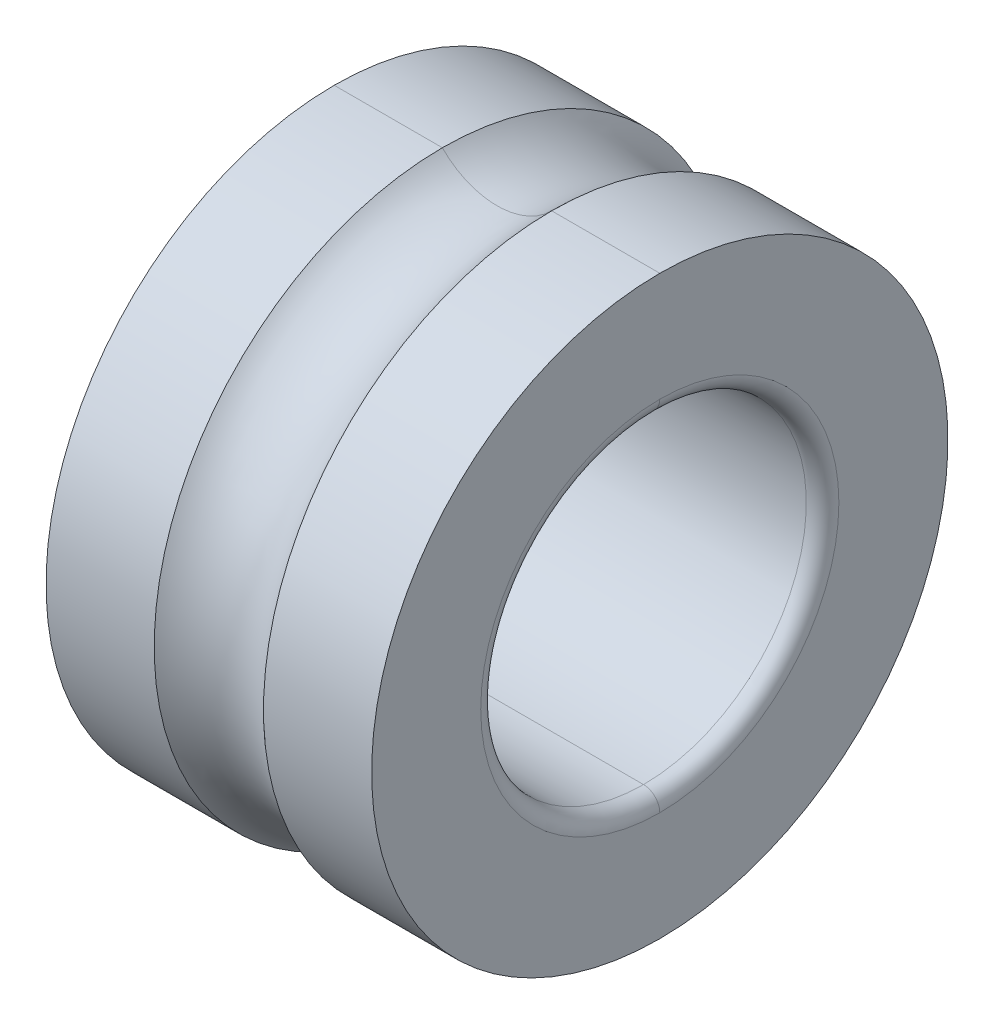
ISO-10303-21;
HEADER;
FILE_DESCRIPTION(('STEP AP214'),'2;1');
FILE_NAME('part.step','',(''),(''),'','','');
FILE_SCHEMA(('AUTOMOTIVE_DESIGN { 1 0 10303 214 1 1 1 1 }'));
ENDSEC;
DATA;
#1=APPLICATION_CONTEXT('core data for automotive mechanical design processes');
#2=APPLICATION_PROTOCOL_DEFINITION('international standard','automotive_design',2000,#1);
#3=PRODUCT_CONTEXT('',#1,'mechanical');
#4=PRODUCT('Part','Part','',(#3));
#5=PRODUCT_RELATED_PRODUCT_CATEGORY('part','',(#4));
#6=PRODUCT_DEFINITION_FORMATION('','',#4);
#7=PRODUCT_DEFINITION_CONTEXT('part definition',#1,'design');
#8=PRODUCT_DEFINITION('design','',#6,#7);
#9=PRODUCT_DEFINITION_SHAPE('','',#8);
#10=(LENGTH_UNIT() NAMED_UNIT(*) SI_UNIT(.MILLI.,.METRE.));
#11=(NAMED_UNIT(*) PLANE_ANGLE_UNIT() SI_UNIT($,.RADIAN.));
#12=(NAMED_UNIT(*) SI_UNIT($,.STERADIAN.) SOLID_ANGLE_UNIT());
#13=UNCERTAINTY_MEASURE_WITH_UNIT(LENGTH_MEASURE(1.E-05),#10,'distance_accuracy_value','');
#14=(GEOMETRIC_REPRESENTATION_CONTEXT(3) GLOBAL_UNCERTAINTY_ASSIGNED_CONTEXT((#13)) GLOBAL_UNIT_ASSIGNED_CONTEXT((#10,
#11,#12)) REPRESENTATION_CONTEXT('',''));
#15=CARTESIAN_POINT('',(0.,0.,0.));
#16=DIRECTION('',(0.,0.,1.));
#17=DIRECTION('',(1.,0.,0.));
#18=AXIS2_PLACEMENT_3D('',#15,#16,#17);
#19=CARTESIAN_POINT('',(-2.75209,0.,0.));
#20=DIRECTION('',(1.,0.,0.));
#21=DIRECTION('',(0.,-1.,0.));
#22=AXIS2_PLACEMENT_3D('',#19,#20,#21);
#23=CYLINDRICAL_SURFACE('',#22,2.5019);
#24=CARTESIAN_POINT('',(-2.25171,0.,0.));
#25=DIRECTION('',(-1.,0.,0.));
#26=DIRECTION('',(0.,1.,0.));
#27=AXIS2_PLACEMENT_3D('',#24,#25,#26);
#28=CIRCLE('',#27,2.5019);
#29=CARTESIAN_POINT('',(-2.25171,2.5019,0.));
#30=VERTEX_POINT('',#29);
#31=CARTESIAN_POINT('',(-2.25171,-2.5019,0.));
#32=VERTEX_POINT('',#31);
#33=EDGE_CURVE('E19',#30,#32,#28,.T.);
#34=ORIENTED_EDGE('',*,*,#33,.T.);
#35=DIRECTION('',(1.,0.,0.));
#36=VECTOR('',#35,1.);
#37=CARTESIAN_POINT('',(-2.25171,-2.5019,0.));
#38=LINE('',#37,#36);
#39=CARTESIAN_POINT('',(2.25171,-2.5019,0.));
#40=VERTEX_POINT('',#39);
#41=EDGE_CURVE('E10',#32,#40,#38,.T.);
#42=ORIENTED_EDGE('',*,*,#41,.T.);
#43=CARTESIAN_POINT('',(2.25171,0.,0.));
#44=DIRECTION('',(-1.,0.,0.));
#45=DIRECTION('',(0.,1.,0.));
#46=AXIS2_PLACEMENT_3D('',#43,#44,#45);
#47=CIRCLE('',#46,2.5019);
#48=CARTESIAN_POINT('',(2.25171,2.5019,0.));
#49=VERTEX_POINT('',#48);
#50=EDGE_CURVE('E84',#49,#40,#47,.T.);
#51=ORIENTED_EDGE('',*,*,#50,.F.);
#52=DIRECTION('',(1.,0.,0.));
#53=VECTOR('',#52,1.);
#54=CARTESIAN_POINT('',(-2.25171,2.5019,0.));
#55=LINE('',#54,#53);
#56=EDGE_CURVE('E24',#30,#49,#55,.T.);
#57=ORIENTED_EDGE('',*,*,#56,.F.);
#58=EDGE_LOOP('',(#34,#42,#51,#57));
#59=FACE_BOUND('',#58,.T.);
#60=ADVANCED_FACE('F16',(#59),#23,.F.);
#61=CARTESIAN_POINT('',(-2.75209,0.,0.));
#62=DIRECTION('',(1.,0.,0.));
#63=DIRECTION('',(0.,-1.,0.));
#64=AXIS2_PLACEMENT_3D('',#61,#62,#63);
#65=CYLINDRICAL_SURFACE('',#64,2.5019);
#66=CARTESIAN_POINT('',(2.25171,0.,0.));
#67=DIRECTION('',(1.,0.,0.));
#68=DIRECTION('',(0.,1.,0.));
#69=AXIS2_PLACEMENT_3D('',#66,#67,#68);
#70=CIRCLE('',#69,2.5019);
#71=EDGE_CURVE('E88',#49,#40,#70,.T.);
#72=ORIENTED_EDGE('',*,*,#71,.T.);
#73=ORIENTED_EDGE('',*,*,#41,.F.);
#74=CARTESIAN_POINT('',(-2.25171,0.,0.));
#75=DIRECTION('',(1.,0.,0.));
#76=DIRECTION('',(0.,1.,0.));
#77=AXIS2_PLACEMENT_3D('',#74,#75,#76);
#78=CIRCLE('',#77,2.5019);
#79=EDGE_CURVE('E91',#30,#32,#78,.T.);
#80=ORIENTED_EDGE('',*,*,#79,.F.);
#81=ORIENTED_EDGE('',*,*,#56,.T.);
#82=EDGE_LOOP('',(#72,#73,#80,#81));
#83=FACE_BOUND('',#82,.T.);
#84=ADVANCED_FACE('F93',(#83),#65,.F.);
#85=CARTESIAN_POINT('',(2.25171,0.,0.));
#86=DIRECTION('',(1.,0.,0.));
#87=DIRECTION('',(0.,-1.,0.));
#88=AXIS2_PLACEMENT_3D('',#85,#86,#87);
#89=TOROIDAL_SURFACE('',#88,2.75209,0.25019);
#90=CARTESIAN_POINT('',(2.5019,0.,0.));
#91=DIRECTION('',(1.,0.,0.));
#92=DIRECTION('',(0.,1.,0.));
#93=AXIS2_PLACEMENT_3D('',#90,#91,#92);
#94=CIRCLE('',#93,2.75209);
#95=CARTESIAN_POINT('',(2.5019,2.75209,0.));
#96=VERTEX_POINT('',#95);
#97=CARTESIAN_POINT('',(2.5019,-2.75209,0.));
#98=VERTEX_POINT('',#97);
#99=EDGE_CURVE('E147',#96,#98,#94,.T.);
#100=ORIENTED_EDGE('',*,*,#99,.T.);
#101=CARTESIAN_POINT('',(2.25171,-2.75209,0.));
#102=DIRECTION('',(0.,0.,-1.));
#103=DIRECTION('',(0.,1.,0.));
#104=AXIS2_PLACEMENT_3D('',#101,#102,#103);
#105=CIRCLE('',#104,0.25019);
#106=EDGE_CURVE('E151',#40,#98,#105,.T.);
#107=ORIENTED_EDGE('',*,*,#106,.F.);
#108=ORIENTED_EDGE('',*,*,#71,.F.);
#109=CARTESIAN_POINT('',(2.25171,2.75209,0.));
#110=DIRECTION('',(0.,0.,1.));
#111=DIRECTION('',(0.,-1.,0.));
#112=AXIS2_PLACEMENT_3D('',#109,#110,#111);
#113=CIRCLE('',#112,0.25019);
#114=EDGE_CURVE('E149',#49,#96,#113,.T.);
#115=ORIENTED_EDGE('',*,*,#114,.T.);
#116=EDGE_LOOP('',(#100,#107,#108,#115));
#117=FACE_BOUND('',#116,.T.);
#118=ADVANCED_FACE('F158',(#117),#89,.T.);
#119=CARTESIAN_POINT('',(2.25171,0.,0.));
#120=DIRECTION('',(1.,0.,0.));
#121=DIRECTION('',(0.,-1.,0.));
#122=AXIS2_PLACEMENT_3D('',#119,#120,#121);
#123=TOROIDAL_SURFACE('',#122,2.75209,0.25019);
#124=ORIENTED_EDGE('',*,*,#50,.T.);
#125=ORIENTED_EDGE('',*,*,#106,.T.);
#126=CARTESIAN_POINT('',(2.5019,0.,0.));
#127=DIRECTION('',(-1.,0.,0.));
#128=DIRECTION('',(0.,1.,0.));
#129=AXIS2_PLACEMENT_3D('',#126,#127,#128);
#130=CIRCLE('',#129,2.75209);
#131=EDGE_CURVE('E144',#96,#98,#130,.T.);
#132=ORIENTED_EDGE('',*,*,#131,.F.);
#133=ORIENTED_EDGE('',*,*,#114,.F.);
#134=EDGE_LOOP('',(#124,#125,#132,#133));
#135=FACE_BOUND('',#134,.T.);
#136=ADVANCED_FACE('F162',(#135),#123,.T.);
#137=CARTESIAN_POINT('',(2.5019,0.,0.));
#138=DIRECTION('',(1.,0.,0.));
#139=DIRECTION('',(0.,-1.,0.));
#140=AXIS2_PLACEMENT_3D('',#137,#138,#139);
#141=PLANE('',#140);
#142=ORIENTED_EDGE('',*,*,#99,.F.);
#143=ORIENTED_EDGE('',*,*,#131,.T.);
#144=EDGE_LOOP('',(#142,#143));
#145=FACE_BOUND('',#144,.T.);
#146=CARTESIAN_POINT('',(2.5019,0.,0.));
#147=DIRECTION('',(-1.,0.,0.));
#148=DIRECTION('',(0.,1.,0.));
#149=AXIS2_PLACEMENT_3D('',#146,#147,#148);
#150=CIRCLE('',#149,4.4283249);
#151=CARTESIAN_POINT('',(2.5019,4.4283249,0.));
#152=VERTEX_POINT('',#151);
#153=CARTESIAN_POINT('',(2.5019,-4.4283249,0.));
#154=VERTEX_POINT('',#153);
#155=EDGE_CURVE('E139',#152,#154,#150,.T.);
#156=ORIENTED_EDGE('',*,*,#155,.F.);
#157=CARTESIAN_POINT('',(2.5019,0.,0.));
#158=DIRECTION('',(1.,0.,0.));
#159=DIRECTION('',(0.,1.,0.));
#160=AXIS2_PLACEMENT_3D('',#157,#158,#159);
#161=CIRCLE('',#160,4.4283249);
#162=EDGE_CURVE('E142',#152,#154,#161,.T.);
#163=ORIENTED_EDGE('',*,*,#162,.T.);
#164=EDGE_LOOP('',(#156,#163));
#165=FACE_BOUND('',#164,.T.);
#166=ADVANCED_FACE('F164',(#145,#165),#141,.T.);
#167=CARTESIAN_POINT('',(-2.75209,0.,0.));
#168=DIRECTION('',(1.,0.,0.));
#169=DIRECTION('',(0.,-1.,0.));
#170=AXIS2_PLACEMENT_3D('',#167,#168,#169);
#171=CYLINDRICAL_SURFACE('',#170,4.4283249);
#172=CARTESIAN_POINT('',(0.839755569912454,0.,0.));
#173=DIRECTION('',(1.,0.,0.));
#174=DIRECTION('',(0.,1.,0.));
#175=AXIS2_PLACEMENT_3D('',#172,#173,#174);
#176=CIRCLE('',#175,4.4283249);
#177=CARTESIAN_POINT('',(0.839755569912454,4.4283249,0.));
#178=VERTEX_POINT('',#177);
#179=CARTESIAN_POINT('',(0.839755569912454,-4.4283249,0.));
#180=VERTEX_POINT('',#179);
#181=EDGE_CURVE('E125',#178,#180,#176,.T.);
#182=ORIENTED_EDGE('',*,*,#181,.T.);
#183=DIRECTION('',(-1.,0.,0.));
#184=VECTOR('',#183,1.);
#185=CARTESIAN_POINT('',(2.5019,-4.4283249,0.));
#186=LINE('',#185,#184);
#187=EDGE_CURVE('E136',#154,#180,#186,.T.);
#188=ORIENTED_EDGE('',*,*,#187,.F.);
#189=ORIENTED_EDGE('',*,*,#162,.F.);
#190=DIRECTION('',(-1.,0.,0.));
#191=VECTOR('',#190,1.);
#192=CARTESIAN_POINT('',(2.5019,4.4283249,0.));
#193=LINE('',#192,#191);
#194=EDGE_CURVE('E134',#152,#178,#193,.T.);
#195=ORIENTED_EDGE('',*,*,#194,.T.);
#196=EDGE_LOOP('',(#182,#188,#189,#195));
#197=FACE_BOUND('',#196,.T.);
#198=ADVANCED_FACE('F167',(#197),#171,.T.);
#199=CARTESIAN_POINT('',(-2.75209,0.,0.));
#200=DIRECTION('',(1.,0.,0.));
#201=DIRECTION('',(0.,-1.,0.));
#202=AXIS2_PLACEMENT_3D('',#199,#200,#201);
#203=CYLINDRICAL_SURFACE('',#202,4.4283249);
#204=ORIENTED_EDGE('',*,*,#155,.T.);
#205=ORIENTED_EDGE('',*,*,#187,.T.);
#206=CARTESIAN_POINT('',(0.839755569912454,0.,0.));
#207=DIRECTION('',(-1.,0.,0.));
#208=DIRECTION('',(0.,1.,0.));
#209=AXIS2_PLACEMENT_3D('',#206,#207,#208);
#210=CIRCLE('',#209,4.4283249);
#211=EDGE_CURVE('E131',#178,#180,#210,.T.);
#212=ORIENTED_EDGE('',*,*,#211,.F.);
#213=ORIENTED_EDGE('',*,*,#194,.F.);
#214=EDGE_LOOP('',(#204,#205,#212,#213));
#215=FACE_BOUND('',#214,.T.);
#216=ADVANCED_FACE('F175',(#215),#203,.T.);
#217=CARTESIAN_POINT('',(0.,0.,0.));
#218=DIRECTION('',(1.,0.,0.));
#219=DIRECTION('',(0.,-1.,0.));
#220=AXIS2_PLACEMENT_3D('',#217,#218,#219);
#221=TOROIDAL_SURFACE('',#220,5.25145,1.175893);
#222=ORIENTED_EDGE('',*,*,#211,.T.);
#223=CARTESIAN_POINT('',(0.,-5.25145,0.));
#224=DIRECTION('',(0.,0.,1.));
#225=DIRECTION('',(0.714142842854285,0.7,0.));
#226=AXIS2_PLACEMENT_3D('',#223,#224,#225);
#227=CIRCLE('',#226,1.175893);
#228=CARTESIAN_POINT('',(-0.839755569912454,-4.4283249,0.));
#229=VERTEX_POINT('',#228);
#230=EDGE_CURVE('E127',#180,#229,#227,.T.);
#231=ORIENTED_EDGE('',*,*,#230,.T.);
#232=CARTESIAN_POINT('',(-0.839755569912454,0.,0.));
#233=DIRECTION('',(-1.,0.,0.));
#234=DIRECTION('',(0.,1.,0.));
#235=AXIS2_PLACEMENT_3D('',#232,#233,#234);
#236=CIRCLE('',#235,4.4283249);
#237=CARTESIAN_POINT('',(-0.839755569912454,4.4283249,0.));
#238=VERTEX_POINT('',#237);
#239=EDGE_CURVE('E118',#238,#229,#236,.T.);
#240=ORIENTED_EDGE('',*,*,#239,.F.);
#241=CARTESIAN_POINT('',(0.,5.25145,0.));
#242=DIRECTION('',(0.,0.,-1.));
#243=DIRECTION('',(0.714142842854285,-0.7,0.));
#244=AXIS2_PLACEMENT_3D('',#241,#242,#243);
#245=CIRCLE('',#244,1.175893);
#246=EDGE_CURVE('E124',#178,#238,#245,.T.);
#247=ORIENTED_EDGE('',*,*,#246,.F.);
#248=EDGE_LOOP('',(#222,#231,#240,#247));
#249=FACE_BOUND('',#248,.T.);
#250=ADVANCED_FACE('F180',(#249),#221,.F.);
#251=CARTESIAN_POINT('',(0.,0.,0.));
#252=DIRECTION('',(1.,0.,0.));
#253=DIRECTION('',(0.,-1.,0.));
#254=AXIS2_PLACEMENT_3D('',#251,#252,#253);
#255=TOROIDAL_SURFACE('',#254,5.25145,1.175893);
#256=CARTESIAN_POINT('',(-0.839755569912454,0.,0.));
#257=DIRECTION('',(1.,0.,0.));
#258=DIRECTION('',(0.,1.,0.));
#259=AXIS2_PLACEMENT_3D('',#256,#257,#258);
#260=CIRCLE('',#259,4.4283249);
#261=EDGE_CURVE('E121',#238,#229,#260,.T.);
#262=ORIENTED_EDGE('',*,*,#261,.T.);
#263=ORIENTED_EDGE('',*,*,#230,.F.);
#264=ORIENTED_EDGE('',*,*,#181,.F.);
#265=ORIENTED_EDGE('',*,*,#246,.T.);
#266=EDGE_LOOP('',(#262,#263,#264,#265));
#267=FACE_BOUND('',#266,.T.);
#268=ADVANCED_FACE('F183',(#267),#255,.F.);
#269=CARTESIAN_POINT('',(-2.75209,0.,0.));
#270=DIRECTION('',(1.,0.,0.));
#271=DIRECTION('',(0.,-1.,0.));
#272=AXIS2_PLACEMENT_3D('',#269,#270,#271);
#273=CYLINDRICAL_SURFACE('',#272,4.4283249);
#274=CARTESIAN_POINT('',(-2.5019,0.,0.));
#275=DIRECTION('',(1.,0.,0.));
#276=DIRECTION('',(0.,1.,0.));
#277=AXIS2_PLACEMENT_3D('',#274,#275,#276);
#278=CIRCLE('',#277,4.4283249);
#279=CARTESIAN_POINT('',(-2.5019,4.4283249,0.));
#280=VERTEX_POINT('',#279);
#281=CARTESIAN_POINT('',(-2.5019,-4.4283249,0.));
#282=VERTEX_POINT('',#281);
#283=EDGE_CURVE('E38',#280,#282,#278,.T.);
#284=ORIENTED_EDGE('',*,*,#283,.T.);
#285=DIRECTION('',(-1.,0.,0.));
#286=VECTOR('',#285,1.);
#287=CARTESIAN_POINT('',(-0.839755569912453,-4.4283249,0.));
#288=LINE('',#287,#286);
#289=EDGE_CURVE('E116',#229,#282,#288,.T.);
#290=ORIENTED_EDGE('',*,*,#289,.F.);
#291=ORIENTED_EDGE('',*,*,#261,.F.);
#292=DIRECTION('',(-1.,0.,0.));
#293=VECTOR('',#292,1.);
#294=CARTESIAN_POINT('',(-0.839755569912453,4.4283249,0.));
#295=LINE('',#294,#293);
#296=EDGE_CURVE('E114',#238,#280,#295,.T.);
#297=ORIENTED_EDGE('',*,*,#296,.T.);
#298=EDGE_LOOP('',(#284,#290,#291,#297));
#299=FACE_BOUND('',#298,.T.);
#300=ADVANCED_FACE('F185',(#299),#273,.T.);
#301=CARTESIAN_POINT('',(-2.75209,0.,0.));
#302=DIRECTION('',(1.,0.,0.));
#303=DIRECTION('',(0.,-1.,0.));
#304=AXIS2_PLACEMENT_3D('',#301,#302,#303);
#305=CYLINDRICAL_SURFACE('',#304,4.4283249);
#306=ORIENTED_EDGE('',*,*,#239,.T.);
#307=ORIENTED_EDGE('',*,*,#289,.T.);
#308=CARTESIAN_POINT('',(-2.5019,0.,0.));
#309=DIRECTION('',(-1.,0.,0.));
#310=DIRECTION('',(0.,1.,0.));
#311=AXIS2_PLACEMENT_3D('',#308,#309,#310);
#312=CIRCLE('',#311,4.4283249);
#313=EDGE_CURVE('E96',#280,#282,#312,.T.);
#314=ORIENTED_EDGE('',*,*,#313,.F.);
#315=ORIENTED_EDGE('',*,*,#296,.F.);
#316=EDGE_LOOP('',(#306,#307,#314,#315));
#317=FACE_BOUND('',#316,.T.);
#318=ADVANCED_FACE('F188',(#317),#305,.T.);
#319=CARTESIAN_POINT('',(-2.5019,0.,0.));
#320=DIRECTION('',(1.,0.,0.));
#321=DIRECTION('',(0.,-1.,0.));
#322=AXIS2_PLACEMENT_3D('',#319,#320,#321);
#323=PLANE('',#322);
#324=CARTESIAN_POINT('',(-2.5019,0.,0.));
#325=DIRECTION('',(-1.,0.,0.));
#326=DIRECTION('',(0.,1.,0.));
#327=AXIS2_PLACEMENT_3D('',#324,#325,#326);
#328=CIRCLE('',#327,2.75209);
#329=CARTESIAN_POINT('',(-2.5019,2.75209,0.));
#330=VERTEX_POINT('',#329);
#331=CARTESIAN_POINT('',(-2.5019,-2.75209,0.));
#332=VERTEX_POINT('',#331);
#333=EDGE_CURVE('E106',#330,#332,#328,.T.);
#334=ORIENTED_EDGE('',*,*,#333,.F.);
#335=CARTESIAN_POINT('',(-2.5019,0.,0.));
#336=DIRECTION('',(1.,0.,0.));
#337=DIRECTION('',(0.,1.,0.));
#338=AXIS2_PLACEMENT_3D('',#335,#336,#337);
#339=CIRCLE('',#338,2.75209);
#340=EDGE_CURVE('E30',#330,#332,#339,.T.);
#341=ORIENTED_EDGE('',*,*,#340,.T.);
#342=EDGE_LOOP('',(#334,#341));
#343=FACE_BOUND('',#342,.T.);
#344=ORIENTED_EDGE('',*,*,#283,.F.);
#345=ORIENTED_EDGE('',*,*,#313,.T.);
#346=EDGE_LOOP('',(#344,#345));
#347=FACE_BOUND('',#346,.T.);
#348=ADVANCED_FACE('F190',(#343,#347),#323,.F.);
#349=CARTESIAN_POINT('',(-2.25171,0.,0.));
#350=DIRECTION('',(1.,0.,0.));
#351=DIRECTION('',(0.,-1.,0.));
#352=AXIS2_PLACEMENT_3D('',#349,#350,#351);
#353=TOROIDAL_SURFACE('',#352,2.75209,0.25019);
#354=ORIENTED_EDGE('',*,*,#79,.T.);
#355=CARTESIAN_POINT('',(-2.25171,-2.75209,0.));
#356=DIRECTION('',(0.,0.,-1.));
#357=DIRECTION('',(-1.,0.,0.));
#358=AXIS2_PLACEMENT_3D('',#355,#356,#357);
#359=CIRCLE('',#358,0.25019);
#360=EDGE_CURVE('E105',#332,#32,#359,.T.);
#361=ORIENTED_EDGE('',*,*,#360,.F.);
#362=ORIENTED_EDGE('',*,*,#340,.F.);
#363=CARTESIAN_POINT('',(-2.25171,2.75209,0.));
#364=DIRECTION('',(0.,0.,1.));
#365=DIRECTION('',(-1.,0.,0.));
#366=AXIS2_PLACEMENT_3D('',#363,#364,#365);
#367=CIRCLE('',#366,0.25019);
#368=EDGE_CURVE('E99',#330,#30,#367,.T.);
#369=ORIENTED_EDGE('',*,*,#368,.T.);
#370=EDGE_LOOP('',(#354,#361,#362,#369));
#371=FACE_BOUND('',#370,.T.);
#372=ADVANCED_FACE('F100',(#371),#353,.T.);
#373=CARTESIAN_POINT('',(-2.25171,0.,0.));
#374=DIRECTION('',(1.,0.,0.));
#375=DIRECTION('',(0.,-1.,0.));
#376=AXIS2_PLACEMENT_3D('',#373,#374,#375);
#377=TOROIDAL_SURFACE('',#376,2.75209,0.25019);
#378=ORIENTED_EDGE('',*,*,#333,.T.);
#379=ORIENTED_EDGE('',*,*,#360,.T.);
#380=ORIENTED_EDGE('',*,*,#33,.F.);
#381=ORIENTED_EDGE('',*,*,#368,.F.);
#382=EDGE_LOOP('',(#378,#379,#380,#381));
#383=FACE_BOUND('',#382,.T.);
#384=ADVANCED_FACE('F104',(#383),#377,.T.);
#385=CLOSED_SHELL('',(#60,#84,#118,#136,#166,#198,#216,#250,#268,#300,#318,#348,#372,#384));
#386=MANIFOLD_SOLID_BREP('B1',#385);
#387=ADVANCED_BREP_SHAPE_REPRESENTATION('',(#18,#386),#14);
#388=SHAPE_DEFINITION_REPRESENTATION(#9,#387);
ENDSEC;
END-ISO-10303-21;
